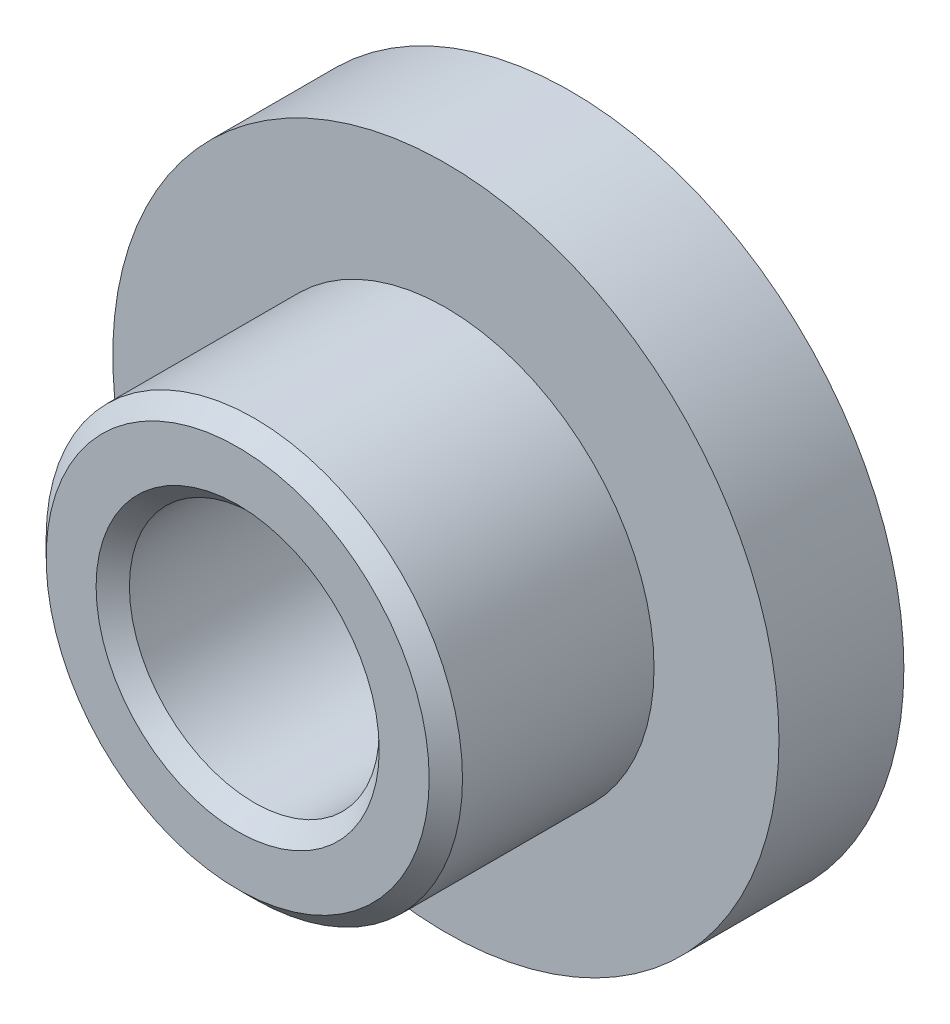
ISO-10303-21;
HEADER;
FILE_DESCRIPTION(('STEP AP214'),'2;1');
FILE_NAME('part.step','',(''),(''),'','','');
FILE_SCHEMA(('AUTOMOTIVE_DESIGN { 1 0 10303 214 1 1 1 1 }'));
ENDSEC;
DATA;
#1=APPLICATION_CONTEXT('core data for automotive mechanical design processes');
#2=APPLICATION_PROTOCOL_DEFINITION('international standard','automotive_design',2000,#1);
#3=PRODUCT_CONTEXT('',#1,'mechanical');
#4=PRODUCT('Part','Part','',(#3));
#5=PRODUCT_RELATED_PRODUCT_CATEGORY('part','',(#4));
#6=PRODUCT_DEFINITION_FORMATION('','',#4);
#7=PRODUCT_DEFINITION_CONTEXT('part definition',#1,'design');
#8=PRODUCT_DEFINITION('design','',#6,#7);
#9=PRODUCT_DEFINITION_SHAPE('','',#8);
#10=(LENGTH_UNIT() NAMED_UNIT(*) SI_UNIT(.MILLI.,.METRE.));
#11=(NAMED_UNIT(*) PLANE_ANGLE_UNIT() SI_UNIT($,.RADIAN.));
#12=(NAMED_UNIT(*) SI_UNIT($,.STERADIAN.) SOLID_ANGLE_UNIT());
#13=UNCERTAINTY_MEASURE_WITH_UNIT(LENGTH_MEASURE(1.E-05),#10,'distance_accuracy_value','');
#14=(GEOMETRIC_REPRESENTATION_CONTEXT(3) GLOBAL_UNCERTAINTY_ASSIGNED_CONTEXT((#13)) GLOBAL_UNIT_ASSIGNED_CONTEXT((#10,
#11,#12)) REPRESENTATION_CONTEXT('',''));
#15=CARTESIAN_POINT('',(0.,0.,0.));
#16=DIRECTION('',(0.,0.,1.));
#17=DIRECTION('',(1.,0.,0.));
#18=AXIS2_PLACEMENT_3D('',#15,#16,#17);
#19=CARTESIAN_POINT('',(0.,0.,3.8));
#20=DIRECTION('',(0.,0.,-1.));
#21=DIRECTION('',(1.,0.,0.));
#22=AXIS2_PLACEMENT_3D('',#19,#20,#21);
#23=CONICAL_SURFACE('',#22,2.5,0.785398163397);
#24=DIRECTION('',(-0.707106781186548,0.,0.707106781186548));
#25=VECTOR('',#24,1.);
#26=CARTESIAN_POINT('',(2.5,0.,3.8));
#27=LINE('',#26,#25);
#28=CARTESIAN_POINT('',(2.5,0.,3.8));
#29=VERTEX_POINT('',#28);
#30=CARTESIAN_POINT('',(2.3,0.,4.));
#31=VERTEX_POINT('',#30);
#32=EDGE_CURVE('E11',#29,#31,#27,.T.);
#33=ORIENTED_EDGE('',*,*,#32,.F.);
#34=CARTESIAN_POINT('',(0.,0.,3.8));
#35=DIRECTION('',(0.,0.,1.));
#36=DIRECTION('',(1.,0.,0.));
#37=AXIS2_PLACEMENT_3D('',#34,#35,#36);
#38=CIRCLE('',#37,2.5);
#39=EDGE_CURVE('E91',#29,#29,#38,.T.);
#40=ORIENTED_EDGE('',*,*,#39,.T.);
#41=ORIENTED_EDGE('',*,*,#32,.T.);
#42=CARTESIAN_POINT('',(0.,0.,4.));
#43=DIRECTION('',(0.,0.,1.));
#44=DIRECTION('',(1.,0.,0.));
#45=AXIS2_PLACEMENT_3D('',#42,#43,#44);
#46=CIRCLE('',#45,2.3);
#47=EDGE_CURVE('E25',#31,#31,#46,.T.);
#48=ORIENTED_EDGE('',*,*,#47,.F.);
#49=EDGE_LOOP('',(#33,#40,#41,#48));
#50=FACE_BOUND('',#49,.T.);
#51=ADVANCED_FACE('F17',(#50),#23,.T.);
#52=CARTESIAN_POINT('',(0.,0.,4.));
#53=DIRECTION('',(0.,0.,1.));
#54=DIRECTION('',(1.,0.,0.));
#55=AXIS2_PLACEMENT_3D('',#52,#53,#54);
#56=PLANE('',#55);
#57=CARTESIAN_POINT('',(0.,0.,4.));
#58=DIRECTION('',(0.,0.,1.));
#59=DIRECTION('',(1.,0.,0.));
#60=AXIS2_PLACEMENT_3D('',#57,#58,#59);
#61=CIRCLE('',#60,1.7);
#62=CARTESIAN_POINT('',(1.7,0.,4.));
#63=VERTEX_POINT('',#62);
#64=EDGE_CURVE('E99',#63,#63,#61,.T.);
#65=ORIENTED_EDGE('',*,*,#64,.F.);
#66=EDGE_LOOP('',(#65));
#67=FACE_BOUND('',#66,.T.);
#68=ORIENTED_EDGE('',*,*,#47,.T.);
#69=EDGE_LOOP('',(#68));
#70=FACE_BOUND('',#69,.T.);
#71=ADVANCED_FACE('F147',(#67,#70),#56,.T.);
#72=CARTESIAN_POINT('',(0.,0.,0.));
#73=DIRECTION('',(0.,0.,1.));
#74=DIRECTION('',(1.,0.,0.));
#75=AXIS2_PLACEMENT_3D('',#72,#73,#74);
#76=CYLINDRICAL_SURFACE('',#75,2.5);
#77=DIRECTION('',(0.,0.,1.));
#78=VECTOR('',#77,1.);
#79=CARTESIAN_POINT('',(2.5,0.,0.));
#80=LINE('',#79,#78);
#81=CARTESIAN_POINT('',(2.5,0.,1.5));
#82=VERTEX_POINT('',#81);
#83=EDGE_CURVE('E124',#82,#29,#80,.T.);
#84=ORIENTED_EDGE('',*,*,#83,.T.);
#85=ORIENTED_EDGE('',*,*,#39,.F.);
#86=ORIENTED_EDGE('',*,*,#83,.F.);
#87=CARTESIAN_POINT('',(0.,0.,1.5));
#88=DIRECTION('',(0.,0.,1.));
#89=DIRECTION('',(1.,0.,0.));
#90=AXIS2_PLACEMENT_3D('',#87,#88,#89);
#91=CIRCLE('',#90,2.5);
#92=EDGE_CURVE('E96',#82,#82,#91,.T.);
#93=ORIENTED_EDGE('',*,*,#92,.T.);
#94=EDGE_LOOP('',(#84,#85,#86,#93));
#95=FACE_BOUND('',#94,.T.);
#96=ADVANCED_FACE('F128',(#95),#76,.T.);
#97=CARTESIAN_POINT('',(0.,0.,3.8));
#98=DIRECTION('',(0.,0.,1.));
#99=DIRECTION('',(1.,0.,0.));
#100=AXIS2_PLACEMENT_3D('',#97,#98,#99);
#101=CONICAL_SURFACE('',#100,1.5,0.785398163397);
#102=ORIENTED_EDGE('',*,*,#64,.T.);
#103=DIRECTION('',(0.707106781186548,0.,0.707106781186548));
#104=VECTOR('',#103,1.);
#105=CARTESIAN_POINT('',(1.5,0.,3.8));
#106=LINE('',#105,#104);
#107=CARTESIAN_POINT('',(1.5,0.,3.8));
#108=VERTEX_POINT('',#107);
#109=EDGE_CURVE('E119',#108,#63,#106,.T.);
#110=ORIENTED_EDGE('',*,*,#109,.F.);
#111=CARTESIAN_POINT('',(0.,0.,3.8));
#112=DIRECTION('',(0.,0.,1.));
#113=DIRECTION('',(1.,0.,0.));
#114=AXIS2_PLACEMENT_3D('',#111,#112,#113);
#115=CIRCLE('',#114,1.5);
#116=EDGE_CURVE('E101',#108,#108,#115,.T.);
#117=ORIENTED_EDGE('',*,*,#116,.F.);
#118=ORIENTED_EDGE('',*,*,#109,.T.);
#119=EDGE_LOOP('',(#102,#110,#117,#118));
#120=FACE_BOUND('',#119,.T.);
#121=ADVANCED_FACE('F134',(#120),#101,.F.);
#122=CARTESIAN_POINT('',(0.,0.,1.5));
#123=DIRECTION('',(0.,0.,1.));
#124=DIRECTION('',(1.,0.,0.));
#125=AXIS2_PLACEMENT_3D('',#122,#123,#124);
#126=PLANE('',#125);
#127=ORIENTED_EDGE('',*,*,#92,.F.);
#128=EDGE_LOOP('',(#127));
#129=FACE_BOUND('',#128,.T.);
#130=CARTESIAN_POINT('',(0.,0.,1.5));
#131=DIRECTION('',(0.,0.,1.));
#132=DIRECTION('',(1.,0.,0.));
#133=AXIS2_PLACEMENT_3D('',#130,#131,#132);
#134=CIRCLE('',#133,4.);
#135=CARTESIAN_POINT('',(4.,0.,1.5));
#136=VERTEX_POINT('',#135);
#137=EDGE_CURVE('E78',#136,#136,#134,.T.);
#138=ORIENTED_EDGE('',*,*,#137,.T.);
#139=EDGE_LOOP('',(#138));
#140=FACE_BOUND('',#139,.T.);
#141=ADVANCED_FACE('F131',(#129,#140),#126,.T.);
#142=CARTESIAN_POINT('',(0.,0.,0.));
#143=DIRECTION('',(0.,0.,1.));
#144=DIRECTION('',(1.,0.,0.));
#145=AXIS2_PLACEMENT_3D('',#142,#143,#144);
#146=CYLINDRICAL_SURFACE('',#145,1.5);
#147=CARTESIAN_POINT('',(0.,0.,0.2));
#148=DIRECTION('',(0.,0.,1.));
#149=DIRECTION('',(1.,0.,0.));
#150=AXIS2_PLACEMENT_3D('',#147,#148,#149);
#151=CIRCLE('',#150,1.5);
#152=CARTESIAN_POINT('',(1.5,0.,0.2));
#153=VERTEX_POINT('',#152);
#154=EDGE_CURVE('E80',#153,#153,#151,.T.);
#155=ORIENTED_EDGE('',*,*,#154,.F.);
#156=DIRECTION('',(0.,0.,1.));
#157=VECTOR('',#156,1.);
#158=CARTESIAN_POINT('',(1.5,0.,0.));
#159=LINE('',#158,#157);
#160=EDGE_CURVE('E107',#153,#108,#159,.T.);
#161=ORIENTED_EDGE('',*,*,#160,.T.);
#162=ORIENTED_EDGE('',*,*,#116,.T.);
#163=ORIENTED_EDGE('',*,*,#160,.F.);
#164=EDGE_LOOP('',(#155,#161,#162,#163));
#165=FACE_BOUND('',#164,.T.);
#166=ADVANCED_FACE('F133',(#165),#146,.F.);
#167=CARTESIAN_POINT('',(0.,0.,0.));
#168=DIRECTION('',(0.,0.,1.));
#169=DIRECTION('',(1.,0.,0.));
#170=AXIS2_PLACEMENT_3D('',#167,#168,#169);
#171=CYLINDRICAL_SURFACE('',#170,4.);
#172=ORIENTED_EDGE('',*,*,#137,.F.);
#173=DIRECTION('',(0.,0.,1.));
#174=VECTOR('',#173,1.);
#175=CARTESIAN_POINT('',(4.,0.,0.));
#176=LINE('',#175,#174);
#177=CARTESIAN_POINT('',(4.,0.,0.));
#178=VERTEX_POINT('',#177);
#179=EDGE_CURVE('E104',#178,#136,#176,.T.);
#180=ORIENTED_EDGE('',*,*,#179,.F.);
#181=CARTESIAN_POINT('',(0.,0.,0.));
#182=DIRECTION('',(0.,0.,1.));
#183=DIRECTION('',(1.,0.,0.));
#184=AXIS2_PLACEMENT_3D('',#181,#182,#183);
#185=CIRCLE('',#184,4.);
#186=EDGE_CURVE('E82',#178,#178,#185,.T.);
#187=ORIENTED_EDGE('',*,*,#186,.T.);
#188=ORIENTED_EDGE('',*,*,#179,.T.);
#189=EDGE_LOOP('',(#172,#180,#187,#188));
#190=FACE_BOUND('',#189,.T.);
#191=ADVANCED_FACE('F137',(#190),#171,.T.);
#192=CARTESIAN_POINT('',(0.,0.,0.2));
#193=DIRECTION('',(0.,0.,-1.));
#194=DIRECTION('',(1.,0.,0.));
#195=AXIS2_PLACEMENT_3D('',#192,#193,#194);
#196=CONICAL_SURFACE('',#195,1.5,0.785398163397);
#197=ORIENTED_EDGE('',*,*,#154,.T.);
#198=DIRECTION('',(-0.707106781186548,0.,0.707106781186548));
#199=VECTOR('',#198,1.);
#200=CARTESIAN_POINT('',(1.5,0.,0.2));
#201=LINE('',#200,#199);
#202=CARTESIAN_POINT('',(1.7,0.,0.));
#203=VERTEX_POINT('',#202);
#204=EDGE_CURVE('E71',#203,#153,#201,.T.);
#205=ORIENTED_EDGE('',*,*,#204,.F.);
#206=CARTESIAN_POINT('',(0.,0.,0.));
#207=DIRECTION('',(0.,0.,1.));
#208=DIRECTION('',(1.,0.,0.));
#209=AXIS2_PLACEMENT_3D('',#206,#207,#208);
#210=CIRCLE('',#209,1.7);
#211=EDGE_CURVE('E74',#203,#203,#210,.T.);
#212=ORIENTED_EDGE('',*,*,#211,.F.);
#213=ORIENTED_EDGE('',*,*,#204,.T.);
#214=EDGE_LOOP('',(#197,#205,#212,#213));
#215=FACE_BOUND('',#214,.T.);
#216=ADVANCED_FACE('F72',(#215),#196,.F.);
#217=CARTESIAN_POINT('',(0.,0.,0.));
#218=DIRECTION('',(0.,0.,1.));
#219=DIRECTION('',(1.,0.,0.));
#220=AXIS2_PLACEMENT_3D('',#217,#218,#219);
#221=PLANE('',#220);
#222=ORIENTED_EDGE('',*,*,#186,.F.);
#223=EDGE_LOOP('',(#222));
#224=FACE_BOUND('',#223,.T.);
#225=ORIENTED_EDGE('',*,*,#211,.T.);
#226=EDGE_LOOP('',(#225));
#227=FACE_BOUND('',#226,.T.);
#228=ADVANCED_FACE('F85',(#224,#227),#221,.F.);
#229=CLOSED_SHELL('',(#51,#71,#96,#121,#141,#166,#191,#216,#228));
#230=MANIFOLD_SOLID_BREP('B1',#229);
#231=ADVANCED_BREP_SHAPE_REPRESENTATION('',(#18,#230),#14);
#232=SHAPE_DEFINITION_REPRESENTATION(#9,#231);
ENDSEC;
END-ISO-10303-21;
